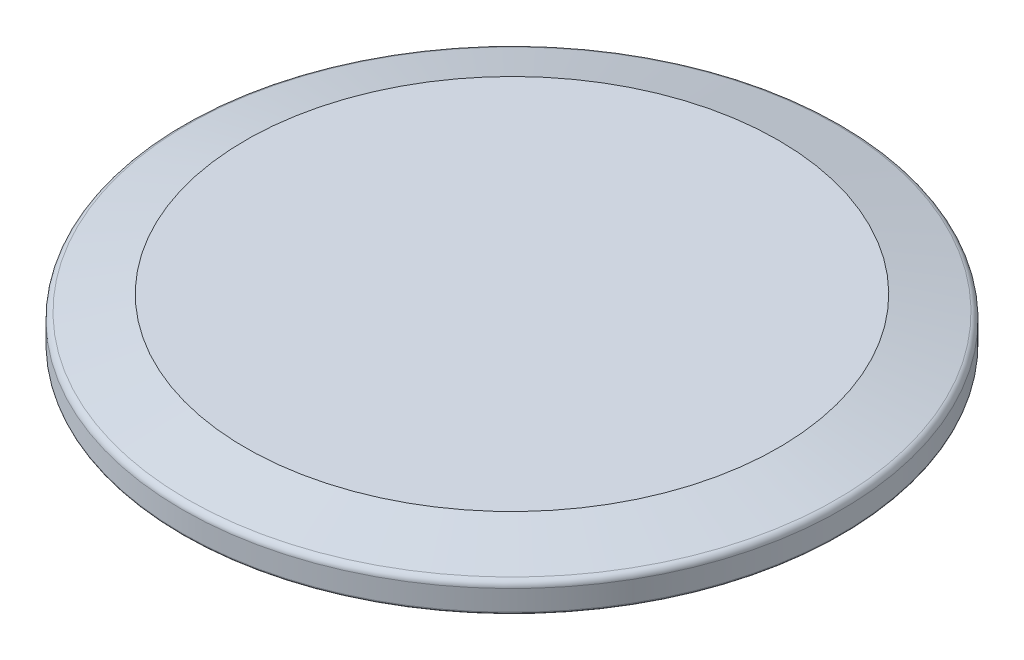
ISO-10303-21;
HEADER;
FILE_DESCRIPTION(('STEP AP214'),'2;1');
FILE_NAME('part.step','',(''),(''),'','','');
FILE_SCHEMA(('AUTOMOTIVE_DESIGN { 1 0 10303 214 1 1 1 1 }'));
ENDSEC;
DATA;
#1=APPLICATION_CONTEXT('core data for automotive mechanical design processes');
#2=APPLICATION_PROTOCOL_DEFINITION('international standard','automotive_design',2000,#1);
#3=PRODUCT_CONTEXT('',#1,'mechanical');
#4=PRODUCT('Part','Part','',(#3));
#5=PRODUCT_RELATED_PRODUCT_CATEGORY('part','',(#4));
#6=PRODUCT_DEFINITION_FORMATION('','',#4);
#7=PRODUCT_DEFINITION_CONTEXT('part definition',#1,'design');
#8=PRODUCT_DEFINITION('design','',#6,#7);
#9=PRODUCT_DEFINITION_SHAPE('','',#8);
#10=(LENGTH_UNIT() NAMED_UNIT(*) SI_UNIT(.MILLI.,.METRE.));
#11=(NAMED_UNIT(*) PLANE_ANGLE_UNIT() SI_UNIT($,.RADIAN.));
#12=(NAMED_UNIT(*) SI_UNIT($,.STERADIAN.) SOLID_ANGLE_UNIT());
#13=UNCERTAINTY_MEASURE_WITH_UNIT(LENGTH_MEASURE(1.E-05),#10,'distance_accuracy_value','');
#14=(GEOMETRIC_REPRESENTATION_CONTEXT(3) GLOBAL_UNCERTAINTY_ASSIGNED_CONTEXT((#13)) GLOBAL_UNIT_ASSIGNED_CONTEXT((#10,
#11,#12)) REPRESENTATION_CONTEXT('',''));
#15=CARTESIAN_POINT('',(0.,0.,0.));
#16=DIRECTION('',(0.,0.,1.));
#17=DIRECTION('',(1.,0.,0.));
#18=AXIS2_PLACEMENT_3D('',#15,#16,#17);
#19=CARTESIAN_POINT('',(0.,0.,26.1));
#20=DIRECTION('',(0.,1.,0.));
#21=DIRECTION('',(0.,0.,1.));
#22=AXIS2_PLACEMENT_3D('',#19,#20,#21);
#23=PLANE('',#22);
#24=CARTESIAN_POINT('',(0.,0.,0.));
#25=DIRECTION('',(0.,1.,0.));
#26=DIRECTION('',(0.,0.,1.));
#27=AXIS2_PLACEMENT_3D('',#24,#25,#26);
#28=CIRCLE('',#27,37.246);
#29=CARTESIAN_POINT('',(0.,0.,37.246));
#30=VERTEX_POINT('',#29);
#31=EDGE_CURVE('E43',#30,#30,#28,.F.);
#32=ORIENTED_EDGE('',*,*,#31,.T.);
#33=EDGE_LOOP('',(#32));
#34=FACE_BOUND('',#33,.T.);
#35=CARTESIAN_POINT('',(0.,0.,0.));
#36=DIRECTION('',(0.,-1.,0.));
#37=DIRECTION('',(0.,0.,-1.));
#38=AXIS2_PLACEMENT_3D('',#35,#36,#37);
#39=CIRCLE('',#38,26.1);
#40=CARTESIAN_POINT('',(0.,0.,-26.1));
#41=VERTEX_POINT('',#40);
#42=EDGE_CURVE('E62',#41,#41,#39,.T.);
#43=ORIENTED_EDGE('',*,*,#42,.F.);
#44=EDGE_LOOP('',(#43));
#45=FACE_BOUND('',#44,.T.);
#46=ADVANCED_FACE('F36',(#34,#45),#23,.F.);
#47=CARTESIAN_POINT('',(0.,0.,0.));
#48=DIRECTION('',(0.,-1.,0.));
#49=DIRECTION('',(0.,0.,-1.));
#50=AXIS2_PLACEMENT_3D('',#47,#48,#49);
#51=CYLINDRICAL_SURFACE('',#50,37.5);
#52=CARTESIAN_POINT('',(0.,0.253999999999999,0.));
#53=DIRECTION('',(0.,1.,0.));
#54=DIRECTION('',(0.,0.,1.));
#55=AXIS2_PLACEMENT_3D('',#52,#53,#54);
#56=CIRCLE('',#55,37.5);
#57=CARTESIAN_POINT('',(0.,0.253999999999999,37.5));
#58=VERTEX_POINT('',#57);
#59=EDGE_CURVE('E10',#58,#58,#56,.T.);
#60=ORIENTED_EDGE('',*,*,#59,.T.);
#61=EDGE_LOOP('',(#60));
#62=FACE_BOUND('',#61,.T.);
#63=CARTESIAN_POINT('',(0.,2.59029683516003,0.));
#64=DIRECTION('',(0.,1.,0.));
#65=DIRECTION('',(0.,0.,1.));
#66=AXIS2_PLACEMENT_3D('',#63,#64,#65);
#67=CIRCLE('',#66,37.5);
#68=CARTESIAN_POINT('',(0.,2.59029683516003,37.5));
#69=VERTEX_POINT('',#68);
#70=EDGE_CURVE('E51',#69,#69,#67,.F.);
#71=ORIENTED_EDGE('',*,*,#70,.T.);
#72=EDGE_LOOP('',(#71));
#73=FACE_BOUND('',#72,.T.);
#74=ADVANCED_FACE('F87',(#62,#73),#51,.T.);
#75=CARTESIAN_POINT('',(0.,5.1,0.));
#76=DIRECTION('',(0.,-1.,0.));
#77=DIRECTION('',(0.,0.,-1.));
#78=AXIS2_PLACEMENT_3D('',#75,#76,#77);
#79=CONICAL_SURFACE('',#78,30.3158021954298,1.30899693899575);
#80=CARTESIAN_POINT('',(0.,3.3263323147923,0.));
#81=DIRECTION('',(0.,1.,0.));
#82=DIRECTION('',(0.,0.,1.));
#83=AXIS2_PLACEMENT_3D('',#80,#81,#82);
#84=CIRCLE('',#83,36.9352201123681);
#85=CARTESIAN_POINT('',(0.,3.3263323147923,36.9352201123681));
#86=VERTEX_POINT('',#85);
#87=EDGE_CURVE('E47',#86,#86,#84,.T.);
#88=ORIENTED_EDGE('',*,*,#87,.T.);
#89=EDGE_LOOP('',(#88));
#90=FACE_BOUND('',#89,.T.);
#91=CARTESIAN_POINT('',(0.,5.1,0.));
#92=DIRECTION('',(0.,-1.,0.));
#93=DIRECTION('',(0.,0.,-1.));
#94=AXIS2_PLACEMENT_3D('',#91,#92,#93);
#95=CIRCLE('',#94,30.3158021954298);
#96=CARTESIAN_POINT('',(0.,5.1,-30.3158021954298));
#97=VERTEX_POINT('',#96);
#98=EDGE_CURVE('E56',#97,#97,#95,.T.);
#99=ORIENTED_EDGE('',*,*,#98,.T.);
#100=EDGE_LOOP('',(#99));
#101=FACE_BOUND('',#100,.T.);
#102=ADVANCED_FACE('F92',(#90,#101),#79,.T.);
#103=CARTESIAN_POINT('',(0.,5.1,30.3158021954298));
#104=DIRECTION('',(0.,-1.,0.));
#105=DIRECTION('',(0.,0.,-1.));
#106=AXIS2_PLACEMENT_3D('',#103,#104,#105);
#107=PLANE('',#106);
#108=ORIENTED_EDGE('',*,*,#98,.F.);
#109=EDGE_LOOP('',(#108));
#110=FACE_BOUND('',#109,.T.);
#111=ADVANCED_FACE('F98',(#110),#107,.F.);
#112=CARTESIAN_POINT('',(0.,2.5,0.));
#113=DIRECTION('',(0.,1.,0.));
#114=DIRECTION('',(0.,0.,1.));
#115=AXIS2_PLACEMENT_3D('',#112,#113,#114);
#116=PLANE('',#115);
#117=CARTESIAN_POINT('',(0.,2.5,0.));
#118=DIRECTION('',(0.,1.,0.));
#119=DIRECTION('',(0.,0.,1.));
#120=AXIS2_PLACEMENT_3D('',#117,#118,#119);
#121=CIRCLE('',#120,19.8);
#122=CARTESIAN_POINT('',(0.,2.5,19.8));
#123=VERTEX_POINT('',#122);
#124=EDGE_CURVE('E65',#123,#123,#121,.T.);
#125=ORIENTED_EDGE('',*,*,#124,.T.);
#126=EDGE_LOOP('',(#125));
#127=FACE_BOUND('',#126,.T.);
#128=CARTESIAN_POINT('',(0.,2.5,0.));
#129=DIRECTION('',(0.,-1.,0.));
#130=DIRECTION('',(0.,0.,-1.));
#131=AXIS2_PLACEMENT_3D('',#128,#129,#130);
#132=CIRCLE('',#131,26.1);
#133=CARTESIAN_POINT('',(0.,2.5,-26.1));
#134=VERTEX_POINT('',#133);
#135=EDGE_CURVE('E59',#134,#134,#132,.T.);
#136=ORIENTED_EDGE('',*,*,#135,.T.);
#137=EDGE_LOOP('',(#136));
#138=FACE_BOUND('',#137,.T.);
#139=ADVANCED_FACE('F102',(#127,#138),#116,.F.);
#140=CARTESIAN_POINT('',(0.,0.,0.));
#141=DIRECTION('',(0.,-1.,0.));
#142=DIRECTION('',(0.,0.,-1.));
#143=AXIS2_PLACEMENT_3D('',#140,#141,#142);
#144=CYLINDRICAL_SURFACE('',#143,26.1);
#145=ORIENTED_EDGE('',*,*,#135,.F.);
#146=EDGE_LOOP('',(#145));
#147=FACE_BOUND('',#146,.T.);
#148=ORIENTED_EDGE('',*,*,#42,.T.);
#149=EDGE_LOOP('',(#148));
#150=FACE_BOUND('',#149,.T.);
#151=ADVANCED_FACE('F84',(#147,#150),#144,.F.);
#152=CARTESIAN_POINT('',(0.,0.,0.));
#153=DIRECTION('',(0.,1.,0.));
#154=DIRECTION('',(0.,0.,1.));
#155=AXIS2_PLACEMENT_3D('',#152,#153,#154);
#156=CYLINDRICAL_SURFACE('',#155,19.8);
#157=CARTESIAN_POINT('',(0.,0.,0.));
#158=DIRECTION('',(0.,1.,0.));
#159=DIRECTION('',(0.,0.,1.));
#160=AXIS2_PLACEMENT_3D('',#157,#158,#159);
#161=CIRCLE('',#160,19.8);
#162=CARTESIAN_POINT('',(0.,0.,19.8));
#163=VERTEX_POINT('',#162);
#164=EDGE_CURVE('E68',#163,#163,#161,.T.);
#165=ORIENTED_EDGE('',*,*,#164,.T.);
#166=EDGE_LOOP('',(#165));
#167=FACE_BOUND('',#166,.T.);
#168=ORIENTED_EDGE('',*,*,#124,.F.);
#169=EDGE_LOOP('',(#168));
#170=FACE_BOUND('',#169,.T.);
#171=ADVANCED_FACE('F72',(#167,#170),#156,.T.);
#172=CARTESIAN_POINT('',(0.,0.,0.));
#173=DIRECTION('',(0.,-1.,0.));
#174=DIRECTION('',(0.,0.,-1.));
#175=AXIS2_PLACEMENT_3D('',#172,#173,#174);
#176=PLANE('',#175);
#177=ORIENTED_EDGE('',*,*,#164,.F.);
#178=EDGE_LOOP('',(#177));
#179=FACE_BOUND('',#178,.T.);
#180=ADVANCED_FACE('F75',(#179),#176,.T.);
#181=CARTESIAN_POINT('',(0.,2.59029683516003,0.));
#182=DIRECTION('',(0.,1.,0.));
#183=DIRECTION('',(0.,0.,1.));
#184=AXIS2_PLACEMENT_3D('',#181,#182,#183);
#185=TOROIDAL_SURFACE('',#184,36.738,0.762);
#186=ORIENTED_EDGE('',*,*,#87,.F.);
#187=EDGE_LOOP('',(#186));
#188=FACE_BOUND('',#187,.T.);
#189=ORIENTED_EDGE('',*,*,#70,.F.);
#190=EDGE_LOOP('',(#189));
#191=FACE_BOUND('',#190,.T.);
#192=ADVANCED_FACE('F77',(#188,#191),#185,.T.);
#193=CARTESIAN_POINT('',(0.,0.253999999999999,0.));
#194=DIRECTION('',(0.,1.,0.));
#195=DIRECTION('',(0.,0.,1.));
#196=AXIS2_PLACEMENT_3D('',#193,#194,#195);
#197=TOROIDAL_SURFACE('',#196,37.246,0.254);
#198=ORIENTED_EDGE('',*,*,#59,.F.);
#199=EDGE_LOOP('',(#198));
#200=FACE_BOUND('',#199,.T.);
#201=ORIENTED_EDGE('',*,*,#31,.F.);
#202=EDGE_LOOP('',(#201));
#203=FACE_BOUND('',#202,.T.);
#204=ADVANCED_FACE('F38',(#200,#203),#197,.T.);
#205=CLOSED_SHELL('',(#46,#74,#102,#111,#139,#151,#171,#180,#192,#204));
#206=MANIFOLD_SOLID_BREP('B2',#205);
#207=ADVANCED_BREP_SHAPE_REPRESENTATION('',(#18,#206),#14);
#208=SHAPE_DEFINITION_REPRESENTATION(#9,#207);
ENDSEC;
END-ISO-10303-21;
